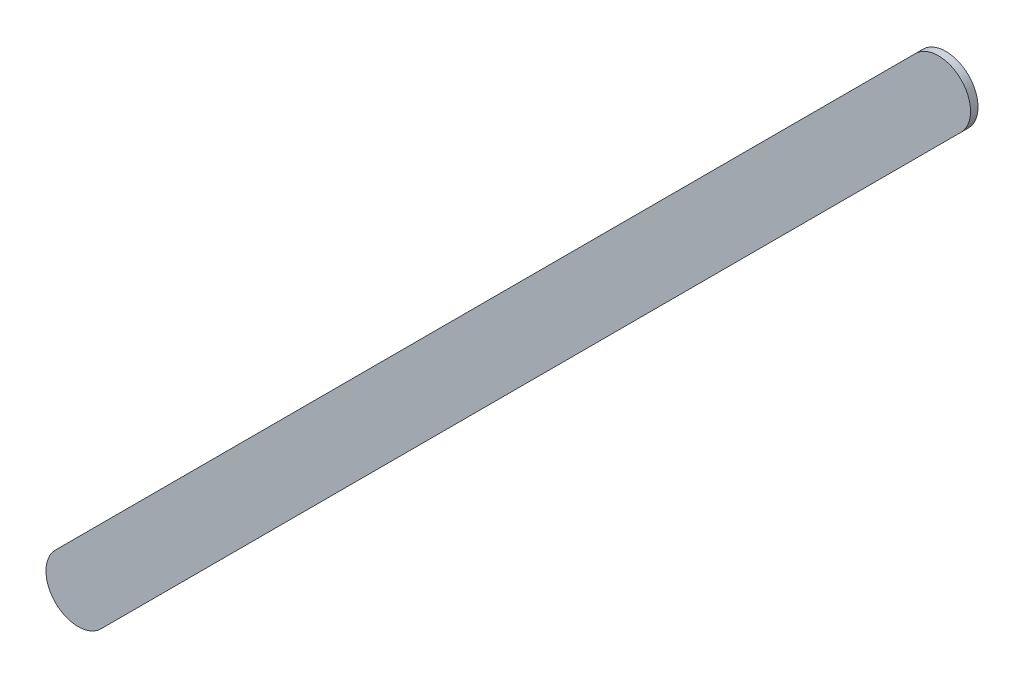
ISO-10303-21;
HEADER;
FILE_DESCRIPTION(('STEP AP214'),'2;1');
FILE_NAME('part.step','',(''),(''),'','','');
FILE_SCHEMA(('AUTOMOTIVE_DESIGN { 1 0 10303 214 1 1 1 1 }'));
ENDSEC;
DATA;
#1=APPLICATION_CONTEXT('core data for automotive mechanical design processes');
#2=APPLICATION_PROTOCOL_DEFINITION('international standard','automotive_design',2000,#1);
#3=PRODUCT_CONTEXT('',#1,'mechanical');
#4=PRODUCT('Part','Part','',(#3));
#5=PRODUCT_RELATED_PRODUCT_CATEGORY('part','',(#4));
#6=PRODUCT_DEFINITION_FORMATION('','',#4);
#7=PRODUCT_DEFINITION_CONTEXT('part definition',#1,'design');
#8=PRODUCT_DEFINITION('design','',#6,#7);
#9=PRODUCT_DEFINITION_SHAPE('','',#8);
#10=(LENGTH_UNIT() NAMED_UNIT(*) SI_UNIT(.MILLI.,.METRE.));
#11=(NAMED_UNIT(*) PLANE_ANGLE_UNIT() SI_UNIT($,.RADIAN.));
#12=(NAMED_UNIT(*) SI_UNIT($,.STERADIAN.) SOLID_ANGLE_UNIT());
#13=UNCERTAINTY_MEASURE_WITH_UNIT(LENGTH_MEASURE(1.E-05),#10,'distance_accuracy_value','');
#14=(GEOMETRIC_REPRESENTATION_CONTEXT(3) GLOBAL_UNCERTAINTY_ASSIGNED_CONTEXT((#13)) GLOBAL_UNIT_ASSIGNED_CONTEXT((#10,
#11,#12)) REPRESENTATION_CONTEXT('',''));
#15=CARTESIAN_POINT('',(0.,0.,0.));
#16=DIRECTION('',(0.,0.,1.));
#17=DIRECTION('',(1.,0.,0.));
#18=AXIS2_PLACEMENT_3D('',#15,#16,#17);
#19=CARTESIAN_POINT('',(121.683933,-84.963933,1.635));
#20=DIRECTION('',(0.,0.,1.));
#21=DIRECTION('',(1.,0.,0.));
#22=AXIS2_PLACEMENT_3D('',#19,#20,#21);
#23=PLANE('',#22);
#24=DIRECTION('',(-0.707106781186548,-0.707106781186548,0.));
#25=VECTOR('',#24,1.);
#26=CARTESIAN_POINT('',(121.683933,-84.963933,1.635));
#27=LINE('',#26,#25);
#28=CARTESIAN_POINT('',(121.683933,-84.963933,1.635));
#29=VERTEX_POINT('',#28);
#30=CARTESIAN_POINT('',(117.673933,-88.973933,1.635));
#31=VERTEX_POINT('',#30);
#32=EDGE_CURVE('E83',#29,#31,#27,.T.);
#33=ORIENTED_EDGE('',*,*,#32,.T.);
#34=CARTESIAN_POINT('',(117.7799995,-89.0799995,1.635));
#35=DIRECTION('',(0.,0.,1.));
#36=DIRECTION('',(-0.707106781186548,0.707106781186548,0.));
#37=AXIS2_PLACEMENT_3D('',#34,#35,#36);
#38=CIRCLE('',#37,0.150000682813);
#39=CARTESIAN_POINT('',(117.886066,-89.186066,1.635));
#40=VERTEX_POINT('',#39);
#41=EDGE_CURVE('E106',#31,#40,#38,.T.);
#42=ORIENTED_EDGE('',*,*,#41,.T.);
#43=DIRECTION('',(0.707106781186548,0.707106781186548,0.));
#44=VECTOR('',#43,1.);
#45=CARTESIAN_POINT('',(117.886066,-89.186066,1.635));
#46=LINE('',#45,#44);
#47=CARTESIAN_POINT('',(121.896066,-85.176066,1.635));
#48=VERTEX_POINT('',#47);
#49=EDGE_CURVE('E21',#40,#48,#46,.T.);
#50=ORIENTED_EDGE('',*,*,#49,.T.);
#51=CARTESIAN_POINT('',(121.7899995,-85.0699995,1.635));
#52=DIRECTION('',(0.,0.,1.));
#53=DIRECTION('',(0.707106781186548,-0.707106781186548,0.));
#54=AXIS2_PLACEMENT_3D('',#51,#52,#53);
#55=CIRCLE('',#54,0.150000682813);
#56=EDGE_CURVE('E11',#48,#29,#55,.T.);
#57=ORIENTED_EDGE('',*,*,#56,.T.);
#58=EDGE_LOOP('',(#33,#42,#50,#57));
#59=FACE_BOUND('',#58,.T.);
#60=ADVANCED_FACE('F17',(#59),#23,.T.);
#61=CARTESIAN_POINT('',(121.683933,-84.963933,1.6));
#62=DIRECTION('',(0.,0.,1.));
#63=DIRECTION('',(1.,0.,0.));
#64=AXIS2_PLACEMENT_3D('',#61,#62,#63);
#65=PLANE('',#64);
#66=CARTESIAN_POINT('',(121.7899995,-85.0699995,1.6));
#67=DIRECTION('',(0.,0.,1.));
#68=DIRECTION('',(0.707106781186548,-0.707106781186548,0.));
#69=AXIS2_PLACEMENT_3D('',#66,#67,#68);
#70=CIRCLE('',#69,0.150000682813);
#71=CARTESIAN_POINT('',(121.896066,-85.176066,1.6));
#72=VERTEX_POINT('',#71);
#73=CARTESIAN_POINT('',(121.683933,-84.963933,1.6));
#74=VERTEX_POINT('',#73);
#75=EDGE_CURVE('E27',#72,#74,#70,.T.);
#76=ORIENTED_EDGE('',*,*,#75,.F.);
#77=DIRECTION('',(0.707106781186548,0.707106781186548,0.));
#78=VECTOR('',#77,1.);
#79=CARTESIAN_POINT('',(117.886066,-89.186066,1.6));
#80=LINE('',#79,#78);
#81=CARTESIAN_POINT('',(117.886066,-89.186066,1.6));
#82=VERTEX_POINT('',#81);
#83=EDGE_CURVE('E100',#82,#72,#80,.T.);
#84=ORIENTED_EDGE('',*,*,#83,.F.);
#85=CARTESIAN_POINT('',(117.7799995,-89.0799995,1.6));
#86=DIRECTION('',(0.,0.,1.));
#87=DIRECTION('',(-0.707106781186548,0.707106781186548,0.));
#88=AXIS2_PLACEMENT_3D('',#85,#86,#87);
#89=CIRCLE('',#88,0.150000682813);
#90=CARTESIAN_POINT('',(117.673933,-88.973933,1.6));
#91=VERTEX_POINT('',#90);
#92=EDGE_CURVE('E85',#91,#82,#89,.T.);
#93=ORIENTED_EDGE('',*,*,#92,.F.);
#94=DIRECTION('',(-0.707106781186548,-0.707106781186548,0.));
#95=VECTOR('',#94,1.);
#96=CARTESIAN_POINT('',(121.683933,-84.963933,1.6));
#97=LINE('',#96,#95);
#98=EDGE_CURVE('E81',#74,#91,#97,.T.);
#99=ORIENTED_EDGE('',*,*,#98,.F.);
#100=EDGE_LOOP('',(#76,#84,#93,#99));
#101=FACE_BOUND('',#100,.T.);
#102=ADVANCED_FACE('F87',(#101),#65,.F.);
#103=CARTESIAN_POINT('',(121.7899995,-85.0699995,1.6));
#104=DIRECTION('',(0.,0.,-1.));
#105=DIRECTION('',(0.707106781186548,-0.707106781186548,0.));
#106=AXIS2_PLACEMENT_3D('',#103,#104,#105);
#107=CYLINDRICAL_SURFACE('',#106,0.150000682813);
#108=ORIENTED_EDGE('',*,*,#75,.T.);
#109=DIRECTION('',(0.,0.,1.));
#110=VECTOR('',#109,1.);
#111=CARTESIAN_POINT('',(121.683933,-84.963933,1.6));
#112=LINE('',#111,#110);
#113=EDGE_CURVE('E70',#74,#29,#112,.T.);
#114=ORIENTED_EDGE('',*,*,#113,.T.);
#115=ORIENTED_EDGE('',*,*,#56,.F.);
#116=DIRECTION('',(0.,0.,1.));
#117=VECTOR('',#116,1.);
#118=CARTESIAN_POINT('',(121.896066,-85.176066,1.6));
#119=LINE('',#118,#117);
#120=EDGE_CURVE('E73',#72,#48,#119,.T.);
#121=ORIENTED_EDGE('',*,*,#120,.F.);
#122=EDGE_LOOP('',(#108,#114,#115,#121));
#123=FACE_BOUND('',#122,.T.);
#124=ADVANCED_FACE('F19',(#123),#107,.T.);
#125=CARTESIAN_POINT('',(117.886066,-89.186066,1.6));
#126=DIRECTION('',(-0.707106781186548,0.707106781186548,0.));
#127=DIRECTION('',(0.,0.,1.));
#128=AXIS2_PLACEMENT_3D('',#125,#126,#127);
#129=PLANE('',#128);
#130=ORIENTED_EDGE('',*,*,#83,.T.);
#131=ORIENTED_EDGE('',*,*,#120,.T.);
#132=ORIENTED_EDGE('',*,*,#49,.F.);
#133=DIRECTION('',(0.,0.,1.));
#134=VECTOR('',#133,1.);
#135=CARTESIAN_POINT('',(117.886066,-89.186066,1.6));
#136=LINE('',#135,#134);
#137=EDGE_CURVE('E102',#82,#40,#136,.T.);
#138=ORIENTED_EDGE('',*,*,#137,.F.);
#139=EDGE_LOOP('',(#130,#131,#132,#138));
#140=FACE_BOUND('',#139,.T.);
#141=ADVANCED_FACE('F118',(#140),#129,.F.);
#142=CARTESIAN_POINT('',(117.7799995,-89.0799995,1.6));
#143=DIRECTION('',(0.,0.,-1.));
#144=DIRECTION('',(-0.707106781186548,0.707106781186548,0.));
#145=AXIS2_PLACEMENT_3D('',#142,#143,#144);
#146=CYLINDRICAL_SURFACE('',#145,0.150000682813);
#147=ORIENTED_EDGE('',*,*,#92,.T.);
#148=ORIENTED_EDGE('',*,*,#137,.T.);
#149=ORIENTED_EDGE('',*,*,#41,.F.);
#150=DIRECTION('',(0.,0.,1.));
#151=VECTOR('',#150,1.);
#152=CARTESIAN_POINT('',(117.673933,-88.973933,1.6));
#153=LINE('',#152,#151);
#154=EDGE_CURVE('E91',#91,#31,#153,.T.);
#155=ORIENTED_EDGE('',*,*,#154,.F.);
#156=EDGE_LOOP('',(#147,#148,#149,#155));
#157=FACE_BOUND('',#156,.T.);
#158=ADVANCED_FACE('F120',(#157),#146,.T.);
#159=CARTESIAN_POINT('',(121.683933,-84.963933,1.6));
#160=DIRECTION('',(0.707106781186548,-0.707106781186548,0.));
#161=DIRECTION('',(0.,0.,-1.));
#162=AXIS2_PLACEMENT_3D('',#159,#160,#161);
#163=PLANE('',#162);
#164=ORIENTED_EDGE('',*,*,#98,.T.);
#165=ORIENTED_EDGE('',*,*,#154,.T.);
#166=ORIENTED_EDGE('',*,*,#32,.F.);
#167=ORIENTED_EDGE('',*,*,#113,.F.);
#168=EDGE_LOOP('',(#164,#165,#166,#167));
#169=FACE_BOUND('',#168,.T.);
#170=ADVANCED_FACE('F79',(#169),#163,.F.);
#171=CLOSED_SHELL('',(#60,#102,#124,#141,#158,#170));
#172=MANIFOLD_SOLID_BREP('B1',#171);
#173=ADVANCED_BREP_SHAPE_REPRESENTATION('',(#18,#172),#14);
#174=SHAPE_DEFINITION_REPRESENTATION(#9,#173);
ENDSEC;
END-ISO-10303-21;
